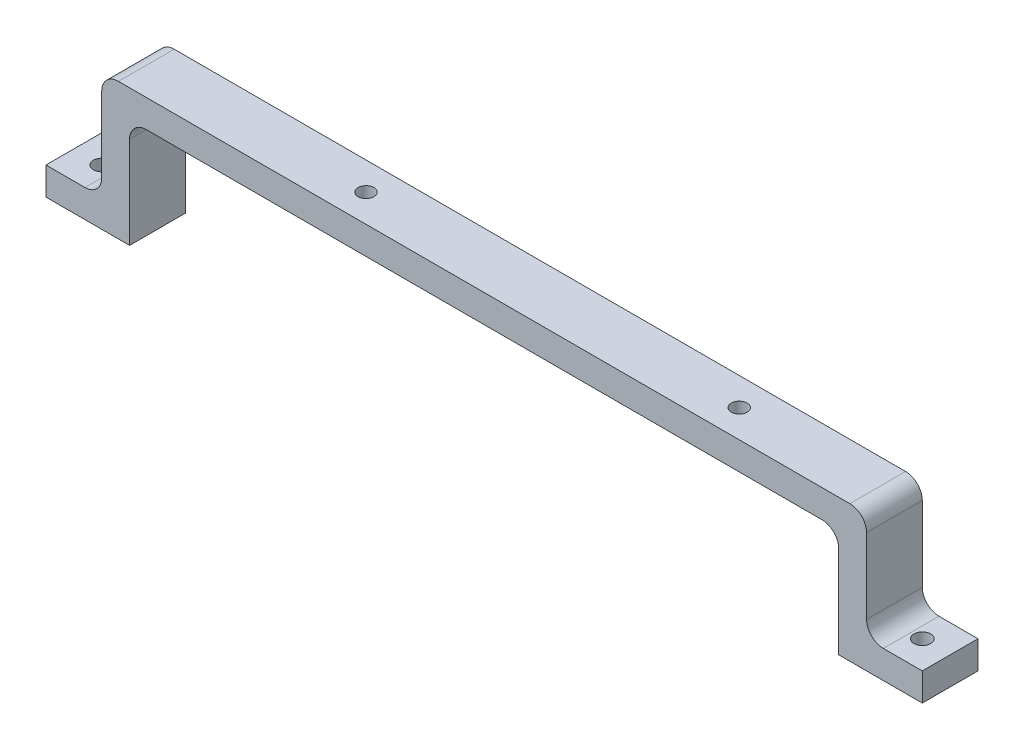
ISO-10303-21;
HEADER;
FILE_DESCRIPTION(('STEP AP214'),'2;1');
FILE_NAME('part.step','',(''),(''),'','','');
FILE_SCHEMA(('AUTOMOTIVE_DESIGN { 1 0 10303 214 1 1 1 1 }'));
ENDSEC;
DATA;
#1=APPLICATION_CONTEXT('core data for automotive mechanical design processes');
#2=APPLICATION_PROTOCOL_DEFINITION('international standard','automotive_design',2000,#1);
#3=PRODUCT_CONTEXT('',#1,'mechanical');
#4=PRODUCT('Part','Part','',(#3));
#5=PRODUCT_RELATED_PRODUCT_CATEGORY('part','',(#4));
#6=PRODUCT_DEFINITION_FORMATION('','',#4);
#7=PRODUCT_DEFINITION_CONTEXT('part definition',#1,'design');
#8=PRODUCT_DEFINITION('design','',#6,#7);
#9=PRODUCT_DEFINITION_SHAPE('','',#8);
#10=(LENGTH_UNIT() NAMED_UNIT(*) SI_UNIT(.MILLI.,.METRE.));
#11=(NAMED_UNIT(*) PLANE_ANGLE_UNIT() SI_UNIT($,.RADIAN.));
#12=(NAMED_UNIT(*) SI_UNIT($,.STERADIAN.) SOLID_ANGLE_UNIT());
#13=UNCERTAINTY_MEASURE_WITH_UNIT(LENGTH_MEASURE(1.E-05),#10,'distance_accuracy_value','');
#14=(GEOMETRIC_REPRESENTATION_CONTEXT(3) GLOBAL_UNCERTAINTY_ASSIGNED_CONTEXT((#13)) GLOBAL_UNIT_ASSIGNED_CONTEXT((#10,
#11,#12)) REPRESENTATION_CONTEXT('',''));
#15=CARTESIAN_POINT('',(0.,0.,0.));
#16=DIRECTION('',(0.,0.,1.));
#17=DIRECTION('',(1.,0.,0.));
#18=AXIS2_PLACEMENT_3D('',#15,#16,#17);
#19=CARTESIAN_POINT('',(0.,0.,10.));
#20=DIRECTION('',(0.,-1.,0.));
#21=DIRECTION('',(1.,0.,0.));
#22=AXIS2_PLACEMENT_3D('',#19,#20,#21);
#23=PLANE('',#22);
#24=CARTESIAN_POINT('',(40.7886030536244,0.,4.99999999999994));
#25=DIRECTION('',(0.,1.,0.));
#26=DIRECTION('',(-1.,0.,0.));
#27=AXIS2_PLACEMENT_3D('',#24,#25,#26);
#28=CIRCLE('',#27,1.42499999999999);
#29=CARTESIAN_POINT('',(39.3636030536244,0.,4.99999999999994));
#30=VERTEX_POINT('',#29);
#31=EDGE_CURVE('E311',#30,#30,#28,.T.);
#32=ORIENTED_EDGE('',*,*,#31,.F.);
#33=EDGE_LOOP('',(#32));
#34=FACE_BOUND('',#33,.T.);
#35=CARTESIAN_POINT('',(-26.2113969463756,0.,4.99999999999994));
#36=DIRECTION('',(0.,1.,0.));
#37=DIRECTION('',(-1.,0.,0.));
#38=AXIS2_PLACEMENT_3D('',#35,#36,#37);
#39=CIRCLE('',#38,1.425);
#40=CARTESIAN_POINT('',(-27.6363969463756,0.,4.99999999999994));
#41=VERTEX_POINT('',#40);
#42=EDGE_CURVE('E317',#41,#41,#39,.T.);
#43=ORIENTED_EDGE('',*,*,#42,.F.);
#44=EDGE_LOOP('',(#43));
#45=FACE_BOUND('',#44,.T.);
#46=DIRECTION('',(-1.,0.,0.));
#47=VECTOR('',#46,1.);
#48=CARTESIAN_POINT('',(0.,0.,10.));
#49=LINE('',#48,#47);
#50=CARTESIAN_POINT('',(65.64,0.,10.));
#51=VERTEX_POINT('',#50);
#52=CARTESIAN_POINT('',(-65.64,0.,10.));
#53=VERTEX_POINT('',#52);
#54=EDGE_CURVE('E217',#51,#53,#49,.T.);
#55=ORIENTED_EDGE('',*,*,#54,.F.);
#56=DIRECTION('',(0.,0.,-1.));
#57=VECTOR('',#56,1.);
#58=CARTESIAN_POINT('',(65.64,0.,0.));
#59=LINE('',#58,#57);
#60=CARTESIAN_POINT('',(65.64,0.,0.));
#61=VERTEX_POINT('',#60);
#62=EDGE_CURVE('E301',#51,#61,#59,.T.);
#63=ORIENTED_EDGE('',*,*,#62,.T.);
#64=DIRECTION('',(-1.,0.,0.));
#65=VECTOR('',#64,1.);
#66=CARTESIAN_POINT('',(0.,0.,0.));
#67=LINE('',#66,#65);
#68=CARTESIAN_POINT('',(-65.64,0.,0.));
#69=VERTEX_POINT('',#68);
#70=EDGE_CURVE('E235',#61,#69,#67,.T.);
#71=ORIENTED_EDGE('',*,*,#70,.T.);
#72=DIRECTION('',(0.,0.,-1.));
#73=VECTOR('',#72,1.);
#74=CARTESIAN_POINT('',(-65.64,0.,10.));
#75=LINE('',#74,#73);
#76=EDGE_CURVE('E277',#69,#53,#75,.F.);
#77=ORIENTED_EDGE('',*,*,#76,.T.);
#78=EDGE_LOOP('',(#55,#63,#71,#77));
#79=FACE_BOUND('',#78,.T.);
#80=ADVANCED_FACE('F36',(#34,#45,#79),#23,.F.);
#81=CARTESIAN_POINT('',(-68.64,0.,10.));
#82=DIRECTION('',(1.,0.,0.));
#83=DIRECTION('',(0.,0.,-1.));
#84=AXIS2_PLACEMENT_3D('',#81,#82,#83);
#85=PLANE('',#84);
#86=DIRECTION('',(0.,-1.,0.));
#87=VECTOR('',#86,1.);
#88=CARTESIAN_POINT('',(-68.64,0.,0.));
#89=LINE('',#88,#87);
#90=CARTESIAN_POINT('',(-68.64,-3.00000000000001,0.));
#91=VERTEX_POINT('',#90);
#92=CARTESIAN_POINT('',(-68.64,-16.5,0.));
#93=VERTEX_POINT('',#92);
#94=EDGE_CURVE('E237',#91,#93,#89,.T.);
#95=ORIENTED_EDGE('',*,*,#94,.T.);
#96=DIRECTION('',(0.,0.,-1.));
#97=VECTOR('',#96,1.);
#98=CARTESIAN_POINT('',(-68.64,-16.5,10.));
#99=LINE('',#98,#97);
#100=CARTESIAN_POINT('',(-68.64,-16.5,10.));
#101=VERTEX_POINT('',#100);
#102=EDGE_CURVE('E267',#93,#101,#99,.F.);
#103=ORIENTED_EDGE('',*,*,#102,.T.);
#104=DIRECTION('',(0.,-1.,0.));
#105=VECTOR('',#104,1.);
#106=CARTESIAN_POINT('',(-68.64,0.,10.));
#107=LINE('',#106,#105);
#108=CARTESIAN_POINT('',(-68.64,-3.00000000000001,10.));
#109=VERTEX_POINT('',#108);
#110=EDGE_CURVE('E219',#109,#101,#107,.T.);
#111=ORIENTED_EDGE('',*,*,#110,.F.);
#112=DIRECTION('',(0.,0.,-1.));
#113=VECTOR('',#112,1.);
#114=CARTESIAN_POINT('',(-68.64,-3.00000000000001,10.));
#115=LINE('',#114,#113);
#116=EDGE_CURVE('E264',#109,#91,#115,.T.);
#117=ORIENTED_EDGE('',*,*,#116,.T.);
#118=EDGE_LOOP('',(#95,#103,#111,#117));
#119=FACE_BOUND('',#118,.T.);
#120=ADVANCED_FACE('F365',(#119),#85,.F.);
#121=CARTESIAN_POINT('',(-68.64,-19.5,10.));
#122=DIRECTION('',(0.,-1.,0.));
#123=DIRECTION('',(1.,0.,0.));
#124=AXIS2_PLACEMENT_3D('',#121,#122,#123);
#125=PLANE('',#124);
#126=CARTESIAN_POINT('',(-73.64,-19.5,5.));
#127=DIRECTION('',(0.,1.,0.));
#128=DIRECTION('',(-1.,0.,0.));
#129=AXIS2_PLACEMENT_3D('',#126,#127,#128);
#130=CIRCLE('',#129,1.5);
#131=CARTESIAN_POINT('',(-75.14,-19.5,5.));
#132=VERTEX_POINT('',#131);
#133=EDGE_CURVE('E176',#132,#132,#130,.T.);
#134=ORIENTED_EDGE('',*,*,#133,.F.);
#135=EDGE_LOOP('',(#134));
#136=FACE_BOUND('',#135,.T.);
#137=DIRECTION('',(-1.,0.,0.));
#138=VECTOR('',#137,1.);
#139=CARTESIAN_POINT('',(-68.64,-19.5,10.));
#140=LINE('',#139,#138);
#141=CARTESIAN_POINT('',(-71.64,-19.5,10.));
#142=VERTEX_POINT('',#141);
#143=CARTESIAN_POINT('',(-78.64,-19.5,10.));
#144=VERTEX_POINT('',#143);
#145=EDGE_CURVE('E223',#142,#144,#140,.T.);
#146=ORIENTED_EDGE('',*,*,#145,.F.);
#147=DIRECTION('',(0.,0.,-1.));
#148=VECTOR('',#147,1.);
#149=CARTESIAN_POINT('',(-71.64,-19.5,0.));
#150=LINE('',#149,#148);
#151=CARTESIAN_POINT('',(-71.64,-19.5,0.));
#152=VERTEX_POINT('',#151);
#153=EDGE_CURVE('E259',#142,#152,#150,.T.);
#154=ORIENTED_EDGE('',*,*,#153,.T.);
#155=DIRECTION('',(-1.,0.,0.));
#156=VECTOR('',#155,1.);
#157=CARTESIAN_POINT('',(-68.64,-19.5,0.));
#158=LINE('',#157,#156);
#159=CARTESIAN_POINT('',(-78.64,-19.5,0.));
#160=VERTEX_POINT('',#159);
#161=EDGE_CURVE('E240',#152,#160,#158,.T.);
#162=ORIENTED_EDGE('',*,*,#161,.T.);
#163=DIRECTION('',(0.,0.,-1.));
#164=VECTOR('',#163,1.);
#165=CARTESIAN_POINT('',(-78.64,-19.5,10.));
#166=LINE('',#165,#164);
#167=EDGE_CURVE('E256',#144,#160,#166,.T.);
#168=ORIENTED_EDGE('',*,*,#167,.F.);
#169=EDGE_LOOP('',(#146,#154,#162,#168));
#170=FACE_BOUND('',#169,.T.);
#171=ADVANCED_FACE('F373',(#136,#170),#125,.F.);
#172=CARTESIAN_POINT('',(-78.64,-19.5,10.));
#173=DIRECTION('',(1.,0.,0.));
#174=DIRECTION('',(0.,0.,-1.));
#175=AXIS2_PLACEMENT_3D('',#172,#173,#174);
#176=PLANE('',#175);
#177=DIRECTION('',(0.,-1.,0.));
#178=VECTOR('',#177,1.);
#179=CARTESIAN_POINT('',(-78.64,-19.5,0.));
#180=LINE('',#179,#178);
#181=CARTESIAN_POINT('',(-78.64,-24.5,0.));
#182=VERTEX_POINT('',#181);
#183=EDGE_CURVE('E242',#160,#182,#180,.T.);
#184=ORIENTED_EDGE('',*,*,#183,.T.);
#185=DIRECTION('',(0.,0.,-1.));
#186=VECTOR('',#185,1.);
#187=CARTESIAN_POINT('',(-78.64,-24.5,10.));
#188=LINE('',#187,#186);
#189=CARTESIAN_POINT('',(-78.64,-24.5,10.));
#190=VERTEX_POINT('',#189);
#191=EDGE_CURVE('E253',#190,#182,#188,.T.);
#192=ORIENTED_EDGE('',*,*,#191,.F.);
#193=DIRECTION('',(0.,-1.,0.));
#194=VECTOR('',#193,1.);
#195=CARTESIAN_POINT('',(-78.64,-19.5,10.));
#196=LINE('',#195,#194);
#197=EDGE_CURVE('E225',#144,#190,#196,.T.);
#198=ORIENTED_EDGE('',*,*,#197,.F.);
#199=ORIENTED_EDGE('',*,*,#167,.T.);
#200=EDGE_LOOP('',(#184,#192,#198,#199));
#201=FACE_BOUND('',#200,.T.);
#202=ADVANCED_FACE('F379',(#201),#176,.F.);
#203=CARTESIAN_POINT('',(-78.64,-24.5,10.));
#204=DIRECTION('',(0.,1.,0.));
#205=DIRECTION('',(0.,0.,1.));
#206=AXIS2_PLACEMENT_3D('',#203,#204,#205);
#207=PLANE('',#206);
#208=CARTESIAN_POINT('',(-73.64,-24.5,5.));
#209=DIRECTION('',(0.,1.,0.));
#210=DIRECTION('',(0.,0.,1.));
#211=AXIS2_PLACEMENT_3D('',#208,#209,#210);
#212=CIRCLE('',#211,1.5);
#213=CARTESIAN_POINT('',(-73.64,-24.5,6.5));
#214=VERTEX_POINT('',#213);
#215=EDGE_CURVE('E216',#214,#214,#212,.T.);
#216=ORIENTED_EDGE('',*,*,#215,.T.);
#217=EDGE_LOOP('',(#216));
#218=FACE_BOUND('',#217,.T.);
#219=DIRECTION('',(1.,0.,0.));
#220=VECTOR('',#219,1.);
#221=CARTESIAN_POINT('',(-78.64,-24.5,0.));
#222=LINE('',#221,#220);
#223=CARTESIAN_POINT('',(-63.64,-24.5,0.));
#224=VERTEX_POINT('',#223);
#225=EDGE_CURVE('E244',#182,#224,#222,.T.);
#226=ORIENTED_EDGE('',*,*,#225,.T.);
#227=DIRECTION('',(0.,0.,-1.));
#228=VECTOR('',#227,1.);
#229=CARTESIAN_POINT('',(-63.64,-24.5,10.));
#230=LINE('',#229,#228);
#231=CARTESIAN_POINT('',(-63.64,-24.5,10.));
#232=VERTEX_POINT('',#231);
#233=EDGE_CURVE('E234',#232,#224,#230,.T.);
#234=ORIENTED_EDGE('',*,*,#233,.F.);
#235=DIRECTION('',(1.,0.,0.));
#236=VECTOR('',#235,1.);
#237=CARTESIAN_POINT('',(-78.64,-24.5,10.));
#238=LINE('',#237,#236);
#239=EDGE_CURVE('E227',#190,#232,#238,.T.);
#240=ORIENTED_EDGE('',*,*,#239,.F.);
#241=ORIENTED_EDGE('',*,*,#191,.T.);
#242=EDGE_LOOP('',(#226,#234,#240,#241));
#243=FACE_BOUND('',#242,.T.);
#244=ADVANCED_FACE('F385',(#218,#243),#207,.F.);
#245=CARTESIAN_POINT('',(-63.64,-24.5,10.));
#246=DIRECTION('',(-1.,0.,0.));
#247=DIRECTION('',(0.,0.,1.));
#248=AXIS2_PLACEMENT_3D('',#245,#246,#247);
#249=PLANE('',#248);
#250=DIRECTION('',(0.,1.,0.));
#251=VECTOR('',#250,1.);
#252=CARTESIAN_POINT('',(-63.64,-24.5,0.));
#253=LINE('',#252,#251);
#254=CARTESIAN_POINT('',(-63.64,-8.,0.));
#255=VERTEX_POINT('',#254);
#256=EDGE_CURVE('E246',#224,#255,#253,.T.);
#257=ORIENTED_EDGE('',*,*,#256,.T.);
#258=DIRECTION('',(0.,0.,-1.));
#259=VECTOR('',#258,1.);
#260=CARTESIAN_POINT('',(-63.64,-8.,10.));
#261=LINE('',#260,#259);
#262=CARTESIAN_POINT('',(-63.64,-8.,10.));
#263=VERTEX_POINT('',#262);
#264=EDGE_CURVE('E272',#255,#263,#261,.F.);
#265=ORIENTED_EDGE('',*,*,#264,.T.);
#266=DIRECTION('',(0.,1.,0.));
#267=VECTOR('',#266,1.);
#268=CARTESIAN_POINT('',(-63.64,-24.5,10.));
#269=LINE('',#268,#267);
#270=EDGE_CURVE('E229',#232,#263,#269,.T.);
#271=ORIENTED_EDGE('',*,*,#270,.F.);
#272=ORIENTED_EDGE('',*,*,#233,.T.);
#273=EDGE_LOOP('',(#257,#265,#271,#272));
#274=FACE_BOUND('',#273,.T.);
#275=ADVANCED_FACE('F389',(#274),#249,.F.);
#276=CARTESIAN_POINT('',(-63.64,-5.,10.));
#277=DIRECTION('',(0.,1.,0.));
#278=DIRECTION('',(-1.,0.,0.));
#279=AXIS2_PLACEMENT_3D('',#276,#277,#278);
#280=PLANE('',#279);
#281=CARTESIAN_POINT('',(40.7886030536244,-5.,4.99999999999994));
#282=DIRECTION('',(0.,1.,0.));
#283=DIRECTION('',(-1.,0.,0.));
#284=AXIS2_PLACEMENT_3D('',#281,#282,#283);
#285=CIRCLE('',#284,1.42499999999999);
#286=CARTESIAN_POINT('',(39.3636030536244,-5.,4.99999999999994));
#287=VERTEX_POINT('',#286);
#288=EDGE_CURVE('E40',#287,#287,#285,.T.);
#289=ORIENTED_EDGE('',*,*,#288,.T.);
#290=EDGE_LOOP('',(#289));
#291=FACE_BOUND('',#290,.T.);
#292=CARTESIAN_POINT('',(-26.2113969463756,-5.,4.99999999999994));
#293=DIRECTION('',(0.,1.,0.));
#294=DIRECTION('',(-1.,0.,0.));
#295=AXIS2_PLACEMENT_3D('',#292,#293,#294);
#296=CIRCLE('',#295,1.425);
#297=CARTESIAN_POINT('',(-27.6363969463756,-5.,4.99999999999994));
#298=VERTEX_POINT('',#297);
#299=EDGE_CURVE('E309',#298,#298,#296,.T.);
#300=ORIENTED_EDGE('',*,*,#299,.T.);
#301=EDGE_LOOP('',(#300));
#302=FACE_BOUND('',#301,.T.);
#303=DIRECTION('',(1.,0.,0.));
#304=VECTOR('',#303,1.);
#305=CARTESIAN_POINT('',(-63.64,-5.,0.));
#306=LINE('',#305,#304);
#307=CARTESIAN_POINT('',(-60.64,-5.,0.));
#308=VERTEX_POINT('',#307);
#309=CARTESIAN_POINT('',(60.64,-5.,0.));
#310=VERTEX_POINT('',#309);
#311=EDGE_CURVE('E220',#308,#310,#306,.T.);
#312=ORIENTED_EDGE('',*,*,#311,.T.);
#313=DIRECTION('',(0.,0.,-1.));
#314=VECTOR('',#313,1.);
#315=CARTESIAN_POINT('',(60.64,-5.,10.));
#316=LINE('',#315,#314);
#317=CARTESIAN_POINT('',(60.64,-5.,10.));
#318=VERTEX_POINT('',#317);
#319=EDGE_CURVE('E299',#310,#318,#316,.F.);
#320=ORIENTED_EDGE('',*,*,#319,.T.);
#321=DIRECTION('',(1.,0.,0.));
#322=VECTOR('',#321,1.);
#323=CARTESIAN_POINT('',(-63.64,-5.,10.));
#324=LINE('',#323,#322);
#325=CARTESIAN_POINT('',(-60.64,-5.,10.));
#326=VERTEX_POINT('',#325);
#327=EDGE_CURVE('E232',#326,#318,#324,.T.);
#328=ORIENTED_EDGE('',*,*,#327,.F.);
#329=DIRECTION('',(0.,0.,-1.));
#330=VECTOR('',#329,1.);
#331=CARTESIAN_POINT('',(-60.64,-5.,0.));
#332=LINE('',#331,#330);
#333=EDGE_CURVE('E269',#326,#308,#332,.T.);
#334=ORIENTED_EDGE('',*,*,#333,.T.);
#335=EDGE_LOOP('',(#312,#320,#328,#334));
#336=FACE_BOUND('',#335,.T.);
#337=ADVANCED_FACE('F396',(#291,#302,#336),#280,.F.);
#338=CARTESIAN_POINT('',(0.,0.,10.));
#339=DIRECTION('',(0.,0.,1.));
#340=DIRECTION('',(1.,0.,0.));
#341=AXIS2_PLACEMENT_3D('',#338,#339,#340);
#342=PLANE('',#341);
#343=DIRECTION('',(0.,-1.,0.));
#344=VECTOR('',#343,1.);
#345=CARTESIAN_POINT('',(68.64,0.,10.));
#346=LINE('',#345,#344);
#347=CARTESIAN_POINT('',(68.64,-2.99999999999999,10.));
#348=VERTEX_POINT('',#347);
#349=CARTESIAN_POINT('',(68.64,-16.5,10.));
#350=VERTEX_POINT('',#349);
#351=EDGE_CURVE('E196',#348,#350,#346,.T.);
#352=ORIENTED_EDGE('',*,*,#351,.F.);
#353=CARTESIAN_POINT('',(65.64,-2.99999999999999,10.));
#354=DIRECTION('',(0.,0.,1.));
#355=DIRECTION('',(1.,0.,0.));
#356=AXIS2_PLACEMENT_3D('',#353,#354,#355);
#357=CIRCLE('',#356,3.);
#358=EDGE_CURVE('E53',#348,#51,#357,.T.);
#359=ORIENTED_EDGE('',*,*,#358,.T.);
#360=ORIENTED_EDGE('',*,*,#54,.T.);
#361=CARTESIAN_POINT('',(-65.64,-3.00000000000001,10.));
#362=DIRECTION('',(0.,0.,1.));
#363=DIRECTION('',(1.,0.,0.));
#364=AXIS2_PLACEMENT_3D('',#361,#362,#363);
#365=CIRCLE('',#364,3.);
#366=EDGE_CURVE('E280',#53,#109,#365,.T.);
#367=ORIENTED_EDGE('',*,*,#366,.T.);
#368=ORIENTED_EDGE('',*,*,#110,.T.);
#369=CARTESIAN_POINT('',(-71.64,-16.5,10.));
#370=DIRECTION('',(0.,0.,1.));
#371=DIRECTION('',(1.,0.,0.));
#372=AXIS2_PLACEMENT_3D('',#369,#370,#371);
#373=CIRCLE('',#372,3.);
#374=EDGE_CURVE('E284',#101,#142,#373,.F.);
#375=ORIENTED_EDGE('',*,*,#374,.T.);
#376=ORIENTED_EDGE('',*,*,#145,.T.);
#377=ORIENTED_EDGE('',*,*,#197,.T.);
#378=ORIENTED_EDGE('',*,*,#239,.T.);
#379=ORIENTED_EDGE('',*,*,#270,.T.);
#380=CARTESIAN_POINT('',(-60.64,-8.,10.));
#381=DIRECTION('',(0.,0.,1.));
#382=DIRECTION('',(1.,0.,0.));
#383=AXIS2_PLACEMENT_3D('',#380,#381,#382);
#384=CIRCLE('',#383,3.);
#385=EDGE_CURVE('E288',#263,#326,#384,.F.);
#386=ORIENTED_EDGE('',*,*,#385,.T.);
#387=ORIENTED_EDGE('',*,*,#327,.T.);
#388=CARTESIAN_POINT('',(60.64,-8.,10.));
#389=DIRECTION('',(0.,0.,1.));
#390=DIRECTION('',(1.,0.,0.));
#391=AXIS2_PLACEMENT_3D('',#388,#389,#390);
#392=CIRCLE('',#391,3.);
#393=CARTESIAN_POINT('',(63.64,-8.,10.));
#394=VERTEX_POINT('',#393);
#395=EDGE_CURVE('E11',#318,#394,#392,.F.);
#396=ORIENTED_EDGE('',*,*,#395,.T.);
#397=DIRECTION('',(0.,1.,0.));
#398=VECTOR('',#397,1.);
#399=CARTESIAN_POINT('',(63.64,-24.5,10.));
#400=LINE('',#399,#398);
#401=CARTESIAN_POINT('',(63.64,-24.5,10.));
#402=VERTEX_POINT('',#401);
#403=EDGE_CURVE('E168',#402,#394,#400,.T.);
#404=ORIENTED_EDGE('',*,*,#403,.F.);
#405=DIRECTION('',(-1.,0.,0.));
#406=VECTOR('',#405,1.);
#407=CARTESIAN_POINT('',(78.64,-24.5,10.));
#408=LINE('',#407,#406);
#409=CARTESIAN_POINT('',(78.64,-24.5,10.));
#410=VERTEX_POINT('',#409);
#411=EDGE_CURVE('E182',#410,#402,#408,.T.);
#412=ORIENTED_EDGE('',*,*,#411,.F.);
#413=DIRECTION('',(0.,-1.,0.));
#414=VECTOR('',#413,1.);
#415=CARTESIAN_POINT('',(78.64,-19.5,10.));
#416=LINE('',#415,#414);
#417=CARTESIAN_POINT('',(78.64,-19.5,10.));
#418=VERTEX_POINT('',#417);
#419=EDGE_CURVE('E189',#418,#410,#416,.T.);
#420=ORIENTED_EDGE('',*,*,#419,.F.);
#421=DIRECTION('',(1.,0.,0.));
#422=VECTOR('',#421,1.);
#423=CARTESIAN_POINT('',(68.64,-19.5,10.));
#424=LINE('',#423,#422);
#425=CARTESIAN_POINT('',(71.64,-19.5,10.));
#426=VERTEX_POINT('',#425);
#427=EDGE_CURVE('E191',#426,#418,#424,.T.);
#428=ORIENTED_EDGE('',*,*,#427,.F.);
#429=CARTESIAN_POINT('',(71.64,-16.5,10.));
#430=DIRECTION('',(0.,0.,1.));
#431=DIRECTION('',(1.,0.,0.));
#432=AXIS2_PLACEMENT_3D('',#429,#430,#431);
#433=CIRCLE('',#432,3.);
#434=EDGE_CURVE('E307',#426,#350,#433,.F.);
#435=ORIENTED_EDGE('',*,*,#434,.T.);
#436=EDGE_LOOP('',(#352,#359,#360,#367,#368,#375,#376,#377,#378,#379,#386,#387,#396,#404,#412,
#420,#428,#435));
#437=FACE_BOUND('',#436,.T.);
#438=ADVANCED_FACE('F180',(#437),#342,.T.);
#439=CARTESIAN_POINT('',(0.,0.,0.));
#440=DIRECTION('',(0.,0.,1.));
#441=DIRECTION('',(1.,0.,0.));
#442=AXIS2_PLACEMENT_3D('',#439,#440,#441);
#443=PLANE('',#442);
#444=ORIENTED_EDGE('',*,*,#70,.F.);
#445=CARTESIAN_POINT('',(65.64,-2.99999999999999,0.));
#446=DIRECTION('',(0.,0.,1.));
#447=DIRECTION('',(1.,0.,0.));
#448=AXIS2_PLACEMENT_3D('',#445,#446,#447);
#449=CIRCLE('',#448,3.);
#450=CARTESIAN_POINT('',(68.64,-2.99999999999999,0.));
#451=VERTEX_POINT('',#450);
#452=EDGE_CURVE('E61',#61,#451,#449,.F.);
#453=ORIENTED_EDGE('',*,*,#452,.T.);
#454=DIRECTION('',(0.,-1.,0.));
#455=VECTOR('',#454,1.);
#456=CARTESIAN_POINT('',(68.64,0.,0.));
#457=LINE('',#456,#455);
#458=CARTESIAN_POINT('',(68.64,-16.5,0.));
#459=VERTEX_POINT('',#458);
#460=EDGE_CURVE('E186',#451,#459,#457,.T.);
#461=ORIENTED_EDGE('',*,*,#460,.T.);
#462=CARTESIAN_POINT('',(71.64,-16.5,0.));
#463=DIRECTION('',(0.,0.,1.));
#464=DIRECTION('',(1.,0.,0.));
#465=AXIS2_PLACEMENT_3D('',#462,#463,#464);
#466=CIRCLE('',#465,3.);
#467=CARTESIAN_POINT('',(71.64,-19.5,0.));
#468=VERTEX_POINT('',#467);
#469=EDGE_CURVE('E305',#459,#468,#466,.T.);
#470=ORIENTED_EDGE('',*,*,#469,.T.);
#471=DIRECTION('',(1.,0.,0.));
#472=VECTOR('',#471,1.);
#473=CARTESIAN_POINT('',(68.64,-19.5,0.));
#474=LINE('',#473,#472);
#475=CARTESIAN_POINT('',(78.64,-19.5,0.));
#476=VERTEX_POINT('',#475);
#477=EDGE_CURVE('E207',#468,#476,#474,.T.);
#478=ORIENTED_EDGE('',*,*,#477,.T.);
#479=DIRECTION('',(0.,-1.,0.));
#480=VECTOR('',#479,1.);
#481=CARTESIAN_POINT('',(78.64,-19.5,0.));
#482=LINE('',#481,#480);
#483=CARTESIAN_POINT('',(78.64,-24.5,0.));
#484=VERTEX_POINT('',#483);
#485=EDGE_CURVE('E204',#476,#484,#482,.T.);
#486=ORIENTED_EDGE('',*,*,#485,.T.);
#487=DIRECTION('',(-1.,0.,0.));
#488=VECTOR('',#487,1.);
#489=CARTESIAN_POINT('',(78.64,-24.5,0.));
#490=LINE('',#489,#488);
#491=CARTESIAN_POINT('',(63.64,-24.5,0.));
#492=VERTEX_POINT('',#491);
#493=EDGE_CURVE('E201',#484,#492,#490,.T.);
#494=ORIENTED_EDGE('',*,*,#493,.T.);
#495=DIRECTION('',(0.,1.,0.));
#496=VECTOR('',#495,1.);
#497=CARTESIAN_POINT('',(63.64,-24.5,0.));
#498=LINE('',#497,#496);
#499=CARTESIAN_POINT('',(63.64,-8.,0.));
#500=VERTEX_POINT('',#499);
#501=EDGE_CURVE('E171',#492,#500,#498,.T.);
#502=ORIENTED_EDGE('',*,*,#501,.T.);
#503=CARTESIAN_POINT('',(60.64,-8.,0.));
#504=DIRECTION('',(0.,0.,1.));
#505=DIRECTION('',(1.,0.,0.));
#506=AXIS2_PLACEMENT_3D('',#503,#504,#505);
#507=CIRCLE('',#506,3.);
#508=EDGE_CURVE('E45',#500,#310,#507,.T.);
#509=ORIENTED_EDGE('',*,*,#508,.T.);
#510=ORIENTED_EDGE('',*,*,#311,.F.);
#511=CARTESIAN_POINT('',(-60.64,-8.,0.));
#512=DIRECTION('',(0.,0.,1.));
#513=DIRECTION('',(1.,0.,0.));
#514=AXIS2_PLACEMENT_3D('',#511,#512,#513);
#515=CIRCLE('',#514,3.);
#516=EDGE_CURVE('E286',#308,#255,#515,.T.);
#517=ORIENTED_EDGE('',*,*,#516,.T.);
#518=ORIENTED_EDGE('',*,*,#256,.F.);
#519=ORIENTED_EDGE('',*,*,#225,.F.);
#520=ORIENTED_EDGE('',*,*,#183,.F.);
#521=ORIENTED_EDGE('',*,*,#161,.F.);
#522=CARTESIAN_POINT('',(-71.64,-16.5,0.));
#523=DIRECTION('',(0.,0.,1.));
#524=DIRECTION('',(1.,0.,0.));
#525=AXIS2_PLACEMENT_3D('',#522,#523,#524);
#526=CIRCLE('',#525,3.);
#527=EDGE_CURVE('E282',#152,#93,#526,.T.);
#528=ORIENTED_EDGE('',*,*,#527,.T.);
#529=ORIENTED_EDGE('',*,*,#94,.F.);
#530=CARTESIAN_POINT('',(-65.64,-3.00000000000001,0.));
#531=DIRECTION('',(0.,0.,1.));
#532=DIRECTION('',(1.,0.,0.));
#533=AXIS2_PLACEMENT_3D('',#530,#531,#532);
#534=CIRCLE('',#533,3.);
#535=EDGE_CURVE('E274',#91,#69,#534,.F.);
#536=ORIENTED_EDGE('',*,*,#535,.T.);
#537=EDGE_LOOP('',(#444,#453,#461,#470,#478,#486,#494,#502,#509,#510,#517,#518,#519,#520,#521,
#528,#529,#536));
#538=FACE_BOUND('',#537,.T.);
#539=ADVANCED_FACE('F355',(#538),#443,.F.);
#540=CARTESIAN_POINT('',(-73.64,-29.5,5.));
#541=DIRECTION('',(0.,1.,0.));
#542=DIRECTION('',(-1.,0.,0.));
#543=AXIS2_PLACEMENT_3D('',#540,#541,#542);
#544=CYLINDRICAL_SURFACE('',#543,1.5);
#545=ORIENTED_EDGE('',*,*,#133,.T.);
#546=EDGE_LOOP('',(#545));
#547=FACE_BOUND('',#546,.T.);
#548=ORIENTED_EDGE('',*,*,#215,.F.);
#549=EDGE_LOOP('',(#548));
#550=FACE_BOUND('',#549,.T.);
#551=ADVANCED_FACE('F420',(#547,#550),#544,.F.);
#552=CARTESIAN_POINT('',(-71.64,-16.5,10.));
#553=DIRECTION('',(0.,0.,1.));
#554=DIRECTION('',(1.,0.,0.));
#555=AXIS2_PLACEMENT_3D('',#552,#553,#554);
#556=CYLINDRICAL_SURFACE('',#555,3.);
#557=ORIENTED_EDGE('',*,*,#374,.F.);
#558=ORIENTED_EDGE('',*,*,#102,.F.);
#559=ORIENTED_EDGE('',*,*,#527,.F.);
#560=ORIENTED_EDGE('',*,*,#153,.F.);
#561=EDGE_LOOP('',(#557,#558,#559,#560));
#562=FACE_BOUND('',#561,.T.);
#563=ADVANCED_FACE('F368',(#562),#556,.F.);
#564=CARTESIAN_POINT('',(-60.64,-8.,10.));
#565=DIRECTION('',(0.,0.,1.));
#566=DIRECTION('',(1.,0.,0.));
#567=AXIS2_PLACEMENT_3D('',#564,#565,#566);
#568=CYLINDRICAL_SURFACE('',#567,3.);
#569=ORIENTED_EDGE('',*,*,#385,.F.);
#570=ORIENTED_EDGE('',*,*,#264,.F.);
#571=ORIENTED_EDGE('',*,*,#516,.F.);
#572=ORIENTED_EDGE('',*,*,#333,.F.);
#573=EDGE_LOOP('',(#569,#570,#571,#572));
#574=FACE_BOUND('',#573,.T.);
#575=ADVANCED_FACE('F392',(#574),#568,.F.);
#576=CARTESIAN_POINT('',(-65.64,-3.00000000000001,10.));
#577=DIRECTION('',(0.,0.,-1.));
#578=DIRECTION('',(-1.,0.,0.));
#579=AXIS2_PLACEMENT_3D('',#576,#577,#578);
#580=CYLINDRICAL_SURFACE('',#579,3.);
#581=ORIENTED_EDGE('',*,*,#366,.F.);
#582=ORIENTED_EDGE('',*,*,#76,.F.);
#583=ORIENTED_EDGE('',*,*,#535,.F.);
#584=ORIENTED_EDGE('',*,*,#116,.F.);
#585=EDGE_LOOP('',(#581,#582,#583,#584));
#586=FACE_BOUND('',#585,.T.);
#587=ADVANCED_FACE('F361',(#586),#580,.T.);
#588=CARTESIAN_POINT('',(63.64,-24.5,10.));
#589=DIRECTION('',(-1.,0.,0.));
#590=DIRECTION('',(0.,0.,1.));
#591=AXIS2_PLACEMENT_3D('',#588,#589,#590);
#592=PLANE('',#591);
#593=ORIENTED_EDGE('',*,*,#403,.T.);
#594=DIRECTION('',(0.,0.,-1.));
#595=VECTOR('',#594,1.);
#596=CARTESIAN_POINT('',(63.64,-8.,10.));
#597=LINE('',#596,#595);
#598=EDGE_CURVE('E297',#394,#500,#597,.T.);
#599=ORIENTED_EDGE('',*,*,#598,.T.);
#600=ORIENTED_EDGE('',*,*,#501,.F.);
#601=DIRECTION('',(0.,0.,-1.));
#602=VECTOR('',#601,1.);
#603=CARTESIAN_POINT('',(63.64,-24.5,10.));
#604=LINE('',#603,#602);
#605=EDGE_CURVE('E164',#402,#492,#604,.T.);
#606=ORIENTED_EDGE('',*,*,#605,.F.);
#607=EDGE_LOOP('',(#593,#599,#600,#606));
#608=FACE_BOUND('',#607,.T.);
#609=ADVANCED_FACE('F166',(#608),#592,.T.);
#610=CARTESIAN_POINT('',(78.64,-24.5,10.));
#611=DIRECTION('',(0.,-1.,0.));
#612=DIRECTION('',(0.,0.,-1.));
#613=AXIS2_PLACEMENT_3D('',#610,#611,#612);
#614=PLANE('',#613);
#615=CARTESIAN_POINT('',(73.64,-24.5,5.));
#616=DIRECTION('',(0.,-1.,0.));
#617=DIRECTION('',(0.,0.,-1.));
#618=AXIS2_PLACEMENT_3D('',#615,#616,#617);
#619=CIRCLE('',#618,1.5);
#620=CARTESIAN_POINT('',(73.64,-24.5,3.5));
#621=VERTEX_POINT('',#620);
#622=EDGE_CURVE('E202',#621,#621,#619,.F.);
#623=ORIENTED_EDGE('',*,*,#622,.T.);
#624=EDGE_LOOP('',(#623));
#625=FACE_BOUND('',#624,.T.);
#626=ORIENTED_EDGE('',*,*,#493,.F.);
#627=DIRECTION('',(0.,0.,-1.));
#628=VECTOR('',#627,1.);
#629=CARTESIAN_POINT('',(78.64,-24.5,10.));
#630=LINE('',#629,#628);
#631=EDGE_CURVE('E177',#410,#484,#630,.T.);
#632=ORIENTED_EDGE('',*,*,#631,.F.);
#633=ORIENTED_EDGE('',*,*,#411,.T.);
#634=ORIENTED_EDGE('',*,*,#605,.T.);
#635=EDGE_LOOP('',(#626,#632,#633,#634));
#636=FACE_BOUND('',#635,.T.);
#637=ADVANCED_FACE('F188',(#625,#636),#614,.T.);
#638=CARTESIAN_POINT('',(78.64,-19.5,10.));
#639=DIRECTION('',(1.,0.,0.));
#640=DIRECTION('',(0.,0.,-1.));
#641=AXIS2_PLACEMENT_3D('',#638,#639,#640);
#642=PLANE('',#641);
#643=ORIENTED_EDGE('',*,*,#485,.F.);
#644=DIRECTION('',(0.,0.,-1.));
#645=VECTOR('',#644,1.);
#646=CARTESIAN_POINT('',(78.64,-19.5,10.));
#647=LINE('',#646,#645);
#648=EDGE_CURVE('E199',#418,#476,#647,.T.);
#649=ORIENTED_EDGE('',*,*,#648,.F.);
#650=ORIENTED_EDGE('',*,*,#419,.T.);
#651=ORIENTED_EDGE('',*,*,#631,.T.);
#652=EDGE_LOOP('',(#643,#649,#650,#651));
#653=FACE_BOUND('',#652,.T.);
#654=ADVANCED_FACE('F340',(#653),#642,.T.);
#655=CARTESIAN_POINT('',(68.64,-19.5,10.));
#656=DIRECTION('',(0.,1.,0.));
#657=DIRECTION('',(-1.,0.,0.));
#658=AXIS2_PLACEMENT_3D('',#655,#656,#657);
#659=PLANE('',#658);
#660=CARTESIAN_POINT('',(73.64,-19.5,5.));
#661=DIRECTION('',(0.,-1.,0.));
#662=DIRECTION('',(1.,0.,0.));
#663=AXIS2_PLACEMENT_3D('',#660,#661,#662);
#664=CIRCLE('',#663,1.5);
#665=CARTESIAN_POINT('',(75.14,-19.5,5.));
#666=VERTEX_POINT('',#665);
#667=EDGE_CURVE('E315',#666,#666,#664,.T.);
#668=ORIENTED_EDGE('',*,*,#667,.T.);
#669=EDGE_LOOP('',(#668));
#670=FACE_BOUND('',#669,.T.);
#671=ORIENTED_EDGE('',*,*,#477,.F.);
#672=DIRECTION('',(0.,0.,-1.));
#673=VECTOR('',#672,1.);
#674=CARTESIAN_POINT('',(71.64,-19.5,10.));
#675=LINE('',#674,#673);
#676=EDGE_CURVE('E295',#468,#426,#675,.F.);
#677=ORIENTED_EDGE('',*,*,#676,.T.);
#678=ORIENTED_EDGE('',*,*,#427,.T.);
#679=ORIENTED_EDGE('',*,*,#648,.T.);
#680=EDGE_LOOP('',(#671,#677,#678,#679));
#681=FACE_BOUND('',#680,.T.);
#682=ADVANCED_FACE('F337',(#670,#681),#659,.T.);
#683=CARTESIAN_POINT('',(68.64,0.,10.));
#684=DIRECTION('',(1.,0.,0.));
#685=DIRECTION('',(0.,0.,-1.));
#686=AXIS2_PLACEMENT_3D('',#683,#684,#685);
#687=PLANE('',#686);
#688=ORIENTED_EDGE('',*,*,#351,.T.);
#689=DIRECTION('',(0.,0.,-1.));
#690=VECTOR('',#689,1.);
#691=CARTESIAN_POINT('',(68.64,-16.5,0.));
#692=LINE('',#691,#690);
#693=EDGE_CURVE('E292',#350,#459,#692,.T.);
#694=ORIENTED_EDGE('',*,*,#693,.T.);
#695=ORIENTED_EDGE('',*,*,#460,.F.);
#696=DIRECTION('',(0.,0.,-1.));
#697=VECTOR('',#696,1.);
#698=CARTESIAN_POINT('',(68.64,-2.99999999999999,10.));
#699=LINE('',#698,#697);
#700=EDGE_CURVE('E290',#451,#348,#699,.F.);
#701=ORIENTED_EDGE('',*,*,#700,.T.);
#702=EDGE_LOOP('',(#688,#694,#695,#701));
#703=FACE_BOUND('',#702,.T.);
#704=ADVANCED_FACE('F333',(#703),#687,.T.);
#705=CARTESIAN_POINT('',(73.64,-29.5,5.));
#706=DIRECTION('',(0.,1.,0.));
#707=DIRECTION('',(-1.,0.,0.));
#708=AXIS2_PLACEMENT_3D('',#705,#706,#707);
#709=CYLINDRICAL_SURFACE('',#708,1.5);
#710=ORIENTED_EDGE('',*,*,#622,.F.);
#711=EDGE_LOOP('',(#710));
#712=FACE_BOUND('',#711,.T.);
#713=ORIENTED_EDGE('',*,*,#667,.F.);
#714=EDGE_LOOP('',(#713));
#715=FACE_BOUND('',#714,.T.);
#716=ADVANCED_FACE('F329',(#712,#715),#709,.F.);
#717=CARTESIAN_POINT('',(71.64,-16.5,10.));
#718=DIRECTION('',(0.,0.,1.));
#719=DIRECTION('',(1.,0.,0.));
#720=AXIS2_PLACEMENT_3D('',#717,#718,#719);
#721=CYLINDRICAL_SURFACE('',#720,3.);
#722=ORIENTED_EDGE('',*,*,#434,.F.);
#723=ORIENTED_EDGE('',*,*,#676,.F.);
#724=ORIENTED_EDGE('',*,*,#469,.F.);
#725=ORIENTED_EDGE('',*,*,#693,.F.);
#726=EDGE_LOOP('',(#722,#723,#724,#725));
#727=FACE_BOUND('',#726,.T.);
#728=ADVANCED_FACE('F332',(#727),#721,.F.);
#729=CARTESIAN_POINT('',(60.64,-8.,10.));
#730=DIRECTION('',(0.,0.,-1.));
#731=DIRECTION('',(-1.,0.,0.));
#732=AXIS2_PLACEMENT_3D('',#729,#730,#731);
#733=CYLINDRICAL_SURFACE('',#732,3.);
#734=ORIENTED_EDGE('',*,*,#395,.F.);
#735=ORIENTED_EDGE('',*,*,#319,.F.);
#736=ORIENTED_EDGE('',*,*,#508,.F.);
#737=ORIENTED_EDGE('',*,*,#598,.F.);
#738=EDGE_LOOP('',(#734,#735,#736,#737));
#739=FACE_BOUND('',#738,.T.);
#740=ADVANCED_FACE('F400',(#739),#733,.F.);
#741=CARTESIAN_POINT('',(65.64,-2.99999999999999,10.));
#742=DIRECTION('',(0.,0.,1.));
#743=DIRECTION('',(1.,0.,0.));
#744=AXIS2_PLACEMENT_3D('',#741,#742,#743);
#745=CYLINDRICAL_SURFACE('',#744,3.);
#746=ORIENTED_EDGE('',*,*,#358,.F.);
#747=ORIENTED_EDGE('',*,*,#700,.F.);
#748=ORIENTED_EDGE('',*,*,#452,.F.);
#749=ORIENTED_EDGE('',*,*,#62,.F.);
#750=EDGE_LOOP('',(#746,#747,#748,#749));
#751=FACE_BOUND('',#750,.T.);
#752=ADVANCED_FACE('F38',(#751),#745,.T.);
#753=CARTESIAN_POINT('',(-26.2113969463756,-10.,4.99999999999994));
#754=DIRECTION('',(0.,1.,0.));
#755=DIRECTION('',(-1.,0.,0.));
#756=AXIS2_PLACEMENT_3D('',#753,#754,#755);
#757=CYLINDRICAL_SURFACE('',#756,1.425);
#758=ORIENTED_EDGE('',*,*,#42,.T.);
#759=EDGE_LOOP('',(#758));
#760=FACE_BOUND('',#759,.T.);
#761=ORIENTED_EDGE('',*,*,#299,.F.);
#762=EDGE_LOOP('',(#761));
#763=FACE_BOUND('',#762,.T.);
#764=ADVANCED_FACE('F430',(#760,#763),#757,.F.);
#765=CARTESIAN_POINT('',(40.7886030536244,-9.99999999999999,4.99999999999994));
#766=DIRECTION('',(0.,1.,0.));
#767=DIRECTION('',(-1.,0.,0.));
#768=AXIS2_PLACEMENT_3D('',#765,#766,#767);
#769=CYLINDRICAL_SURFACE('',#768,1.42499999999999);
#770=ORIENTED_EDGE('',*,*,#31,.T.);
#771=EDGE_LOOP('',(#770));
#772=FACE_BOUND('',#771,.T.);
#773=ORIENTED_EDGE('',*,*,#288,.F.);
#774=EDGE_LOOP('',(#773));
#775=FACE_BOUND('',#774,.T.);
#776=ADVANCED_FACE('F434',(#772,#775),#769,.F.);
#777=CLOSED_SHELL('',(#80,#120,#171,#202,#244,#275,#337,#438,#539,#551,#563,#575,#587,#609,#637,
#654,#682,#704,#716,#728,#740,#752,#764,#776));
#778=MANIFOLD_SOLID_BREP('B2',#777);
#779=ADVANCED_BREP_SHAPE_REPRESENTATION('',(#18,#778),#14);
#780=SHAPE_DEFINITION_REPRESENTATION(#9,#779);
ENDSEC;
END-ISO-10303-21;
